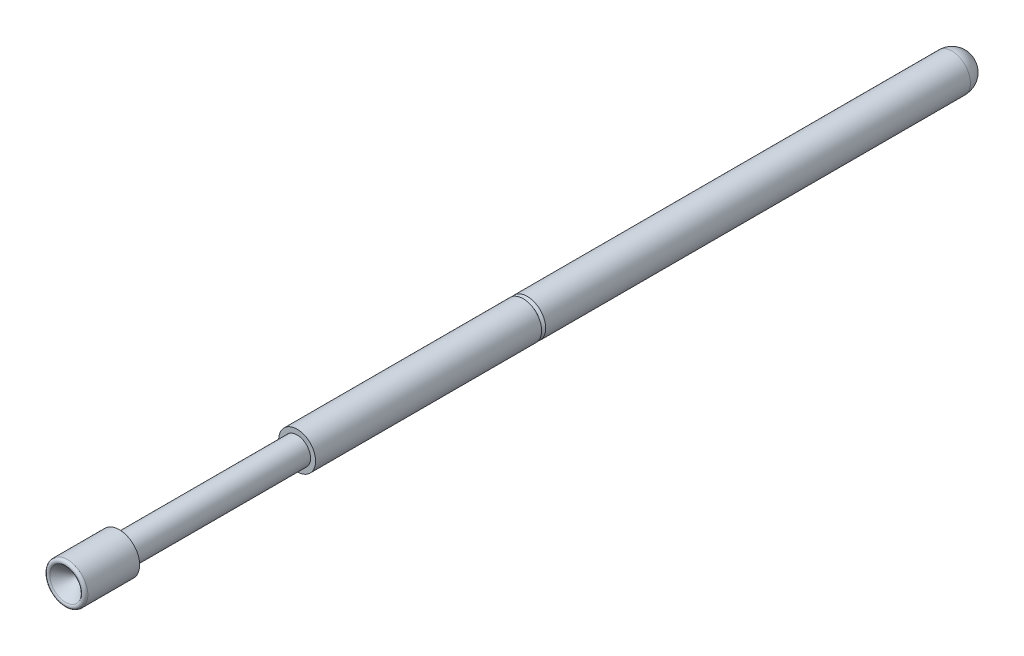
ISO-10303-21;
HEADER;
FILE_DESCRIPTION(('STEP AP214'),'2;1');
FILE_NAME('part.step','',(''),(''),'','','');
FILE_SCHEMA(('AUTOMOTIVE_DESIGN { 1 0 10303 214 1 1 1 1 }'));
ENDSEC;
DATA;
#1=APPLICATION_CONTEXT('core data for automotive mechanical design processes');
#2=APPLICATION_PROTOCOL_DEFINITION('international standard','automotive_design',2000,#1);
#3=PRODUCT_CONTEXT('',#1,'mechanical');
#4=PRODUCT('Part','Part','',(#3));
#5=PRODUCT_RELATED_PRODUCT_CATEGORY('part','',(#4));
#6=PRODUCT_DEFINITION_FORMATION('','',#4);
#7=PRODUCT_DEFINITION_CONTEXT('part definition',#1,'design');
#8=PRODUCT_DEFINITION('design','',#6,#7);
#9=PRODUCT_DEFINITION_SHAPE('','',#8);
#10=(LENGTH_UNIT() NAMED_UNIT(*) SI_UNIT(.MILLI.,.METRE.));
#11=(NAMED_UNIT(*) PLANE_ANGLE_UNIT() SI_UNIT($,.RADIAN.));
#12=(NAMED_UNIT(*) SI_UNIT($,.STERADIAN.) SOLID_ANGLE_UNIT());
#13=UNCERTAINTY_MEASURE_WITH_UNIT(LENGTH_MEASURE(1.E-05),#10,'distance_accuracy_value','');
#14=(GEOMETRIC_REPRESENTATION_CONTEXT(3) GLOBAL_UNCERTAINTY_ASSIGNED_CONTEXT((#13)) GLOBAL_UNIT_ASSIGNED_CONTEXT((#10,
#11,#12)) REPRESENTATION_CONTEXT('',''));
#15=CARTESIAN_POINT('',(0.,0.,0.));
#16=DIRECTION('',(0.,0.,1.));
#17=DIRECTION('',(1.,0.,0.));
#18=AXIS2_PLACEMENT_3D('',#15,#16,#17);
#19=CARTESIAN_POINT('',(0.,0.,0.680000000000002));
#20=DIRECTION('',(0.,0.,-1.));
#21=DIRECTION('',(-1.,0.,0.));
#22=AXIS2_PLACEMENT_3D('',#19,#20,#21);
#23=SPHERICAL_SURFACE('',#22,0.680000000000002);
#24=CARTESIAN_POINT('',(0.,0.,0.680000000000002));
#25=DIRECTION('',(0.,0.,-1.));
#26=DIRECTION('',(-1.,0.,0.));
#27=AXIS2_PLACEMENT_3D('',#24,#25,#26);
#28=CIRCLE('',#27,0.680000000000002);
#29=CARTESIAN_POINT('',(-0.680000000000002,0.,0.680000000000002));
#30=VERTEX_POINT('',#29);
#31=EDGE_CURVE('E78',#30,#30,#28,.T.);
#32=ORIENTED_EDGE('',*,*,#31,.T.);
#33=EDGE_LOOP('',(#32));
#34=FACE_BOUND('',#33,.T.);
#35=ADVANCED_FACE('F34',(#34),#23,.T.);
#36=CARTESIAN_POINT('',(0.,0.,33.3283227248675));
#37=DIRECTION('',(0.,0.,1.));
#38=DIRECTION('',(1.,0.,0.));
#39=AXIS2_PLACEMENT_3D('',#36,#37,#38);
#40=CONICAL_SURFACE('',#39,0.579289321881346,0.785398163397446);
#41=CARTESIAN_POINT('',(0.,0.,32.7490334029862));
#42=VERTEX_POINT('',#41);
#43=VERTEX_LOOP('',#42);
#44=FACE_BOUND('',#43,.T.);
#45=CARTESIAN_POINT('',(0.,0.,33.3283227248675));
#46=DIRECTION('',(0.,0.,-1.));
#47=DIRECTION('',(-1.,0.,0.));
#48=AXIS2_PLACEMENT_3D('',#45,#46,#47);
#49=CIRCLE('',#48,0.579289321881346);
#50=CARTESIAN_POINT('',(-0.579289321881346,0.,33.3283227248675));
#51=VERTEX_POINT('',#50);
#52=EDGE_CURVE('E11',#51,#51,#49,.T.);
#53=ORIENTED_EDGE('',*,*,#52,.F.);
#54=EDGE_LOOP('',(#53));
#55=FACE_BOUND('',#54,.T.);
#56=ADVANCED_FACE('F43',(#44,#55),#40,.F.);
#57=CARTESIAN_POINT('',(0.,0.,33.2576120467489));
#58=DIRECTION('',(0.,0.,-1.));
#59=DIRECTION('',(-1.,0.,0.));
#60=AXIS2_PLACEMENT_3D('',#57,#58,#59);
#61=TOROIDAL_SURFACE('',#60,0.649999999999996,0.100000000000001);
#62=ORIENTED_EDGE('',*,*,#52,.T.);
#63=EDGE_LOOP('',(#62));
#64=FACE_BOUND('',#63,.T.);
#65=CARTESIAN_POINT('',(0.,0.,33.2576120467489));
#66=DIRECTION('',(0.,0.,-1.));
#67=DIRECTION('',(-1.,0.,0.));
#68=AXIS2_PLACEMENT_3D('',#65,#66,#67);
#69=CIRCLE('',#68,0.749999999999997);
#70=CARTESIAN_POINT('',(-0.749999999999997,0.,33.2576120467489));
#71=VERTEX_POINT('',#70);
#72=EDGE_CURVE('E40',#71,#71,#69,.T.);
#73=ORIENTED_EDGE('',*,*,#72,.F.);
#74=EDGE_LOOP('',(#73));
#75=FACE_BOUND('',#74,.T.);
#76=ADVANCED_FACE('F46',(#64,#75),#61,.T.);
#77=CARTESIAN_POINT('',(0.,0.,0.));
#78=DIRECTION('',(0.,0.,-1.));
#79=DIRECTION('',(-1.,0.,0.));
#80=AXIS2_PLACEMENT_3D('',#77,#78,#79);
#81=CYLINDRICAL_SURFACE('',#80,0.749999999999996);
#82=ORIENTED_EDGE('',*,*,#72,.T.);
#83=EDGE_LOOP('',(#82));
#84=FACE_BOUND('',#83,.T.);
#85=CARTESIAN_POINT('',(0.,0.,31.35));
#86=DIRECTION('',(0.,0.,-1.));
#87=DIRECTION('',(-1.,0.,0.));
#88=AXIS2_PLACEMENT_3D('',#85,#86,#87);
#89=CIRCLE('',#88,0.749999999999996);
#90=CARTESIAN_POINT('',(-0.749999999999996,0.,31.35));
#91=VERTEX_POINT('',#90);
#92=EDGE_CURVE('E56',#91,#91,#89,.T.);
#93=ORIENTED_EDGE('',*,*,#92,.F.);
#94=EDGE_LOOP('',(#93));
#95=FACE_BOUND('',#94,.T.);
#96=ADVANCED_FACE('F51',(#84,#95),#81,.T.);
#97=CARTESIAN_POINT('',(-0.749999999999996,0.,31.35));
#98=DIRECTION('',(0.,0.,-1.));
#99=DIRECTION('',(-1.,0.,0.));
#100=AXIS2_PLACEMENT_3D('',#97,#98,#99);
#101=PLANE('',#100);
#102=ORIENTED_EDGE('',*,*,#92,.T.);
#103=EDGE_LOOP('',(#102));
#104=FACE_BOUND('',#103,.T.);
#105=CARTESIAN_POINT('',(0.,0.,31.35));
#106=DIRECTION('',(0.,0.,-1.));
#107=DIRECTION('',(-1.,0.,0.));
#108=AXIS2_PLACEMENT_3D('',#105,#106,#107);
#109=CIRCLE('',#108,0.494999999999996);
#110=CARTESIAN_POINT('',(-0.494999999999996,0.,31.35));
#111=VERTEX_POINT('',#110);
#112=EDGE_CURVE('E58',#111,#111,#109,.T.);
#113=ORIENTED_EDGE('',*,*,#112,.F.);
#114=EDGE_LOOP('',(#113));
#115=FACE_BOUND('',#114,.T.);
#116=ADVANCED_FACE('F111',(#104,#115),#101,.T.);
#117=CARTESIAN_POINT('',(0.,0.,0.));
#118=DIRECTION('',(0.,0.,-1.));
#119=DIRECTION('',(-1.,0.,0.));
#120=AXIS2_PLACEMENT_3D('',#117,#118,#119);
#121=CYLINDRICAL_SURFACE('',#120,0.494999999999996);
#122=ORIENTED_EDGE('',*,*,#112,.T.);
#123=EDGE_LOOP('',(#122));
#124=FACE_BOUND('',#123,.T.);
#125=CARTESIAN_POINT('',(0.,0.,24.8));
#126=DIRECTION('',(0.,0.,-1.));
#127=DIRECTION('',(-1.,0.,0.));
#128=AXIS2_PLACEMENT_3D('',#125,#126,#127);
#129=CIRCLE('',#128,0.494999999999996);
#130=CARTESIAN_POINT('',(-0.494999999999996,0.,24.8));
#131=VERTEX_POINT('',#130);
#132=EDGE_CURVE('E63',#131,#131,#129,.T.);
#133=ORIENTED_EDGE('',*,*,#132,.F.);
#134=EDGE_LOOP('',(#133));
#135=FACE_BOUND('',#134,.T.);
#136=ADVANCED_FACE('F118',(#124,#135),#121,.T.);
#137=CARTESIAN_POINT('',(-0.494999999999996,0.,24.8));
#138=DIRECTION('',(0.,0.,1.));
#139=DIRECTION('',(1.,0.,0.));
#140=AXIS2_PLACEMENT_3D('',#137,#138,#139);
#141=PLANE('',#140);
#142=ORIENTED_EDGE('',*,*,#132,.T.);
#143=EDGE_LOOP('',(#142));
#144=FACE_BOUND('',#143,.T.);
#145=CARTESIAN_POINT('',(0.,0.,24.8));
#146=DIRECTION('',(0.,0.,-1.));
#147=DIRECTION('',(-1.,0.,0.));
#148=AXIS2_PLACEMENT_3D('',#145,#146,#147);
#149=CIRCLE('',#148,0.679999999999997);
#150=CARTESIAN_POINT('',(-0.679999999999997,0.,24.8));
#151=VERTEX_POINT('',#150);
#152=EDGE_CURVE('E66',#151,#151,#149,.T.);
#153=ORIENTED_EDGE('',*,*,#152,.F.);
#154=EDGE_LOOP('',(#153));
#155=FACE_BOUND('',#154,.T.);
#156=ADVANCED_FACE('F126',(#144,#155),#141,.T.);
#157=CARTESIAN_POINT('',(0.,0.,0.));
#158=DIRECTION('',(0.,0.,-1.));
#159=DIRECTION('',(-1.,0.,0.));
#160=AXIS2_PLACEMENT_3D('',#157,#158,#159);
#161=CYLINDRICAL_SURFACE('',#160,0.679999999999998);
#162=ORIENTED_EDGE('',*,*,#152,.T.);
#163=EDGE_LOOP('',(#162));
#164=FACE_BOUND('',#163,.T.);
#165=CARTESIAN_POINT('',(0.,0.,16.475));
#166=DIRECTION('',(0.,0.,-1.));
#167=DIRECTION('',(-1.,0.,0.));
#168=AXIS2_PLACEMENT_3D('',#165,#166,#167);
#169=CIRCLE('',#168,0.68);
#170=CARTESIAN_POINT('',(-0.68,0.,16.475));
#171=VERTEX_POINT('',#170);
#172=EDGE_CURVE('E69',#171,#171,#169,.T.);
#173=ORIENTED_EDGE('',*,*,#172,.F.);
#174=EDGE_LOOP('',(#173));
#175=FACE_BOUND('',#174,.T.);
#176=ADVANCED_FACE('F134',(#164,#175),#161,.T.);
#177=CARTESIAN_POINT('',(0.,0.,16.4));
#178=DIRECTION('',(0.,0.,1.));
#179=DIRECTION('',(1.,0.,0.));
#180=AXIS2_PLACEMENT_3D('',#177,#178,#179);
#181=CONICAL_SURFACE('',#180,0.579289321881343,0.930691014621459);
#182=ORIENTED_EDGE('',*,*,#172,.T.);
#183=EDGE_LOOP('',(#182));
#184=FACE_BOUND('',#183,.T.);
#185=CARTESIAN_POINT('',(0.,0.,16.4));
#186=DIRECTION('',(0.,0.,-1.));
#187=DIRECTION('',(-1.,0.,0.));
#188=AXIS2_PLACEMENT_3D('',#185,#186,#187);
#189=CIRCLE('',#188,0.579289321881343);
#190=CARTESIAN_POINT('',(-0.579289321881343,0.,16.4));
#191=VERTEX_POINT('',#190);
#192=EDGE_CURVE('E72',#191,#191,#189,.T.);
#193=ORIENTED_EDGE('',*,*,#192,.F.);
#194=EDGE_LOOP('',(#193));
#195=FACE_BOUND('',#194,.T.);
#196=ADVANCED_FACE('F91',(#184,#195),#181,.T.);
#197=CARTESIAN_POINT('',(0.,0.,16.325));
#198=DIRECTION('',(0.,0.,-1.));
#199=DIRECTION('',(-1.,0.,0.));
#200=AXIS2_PLACEMENT_3D('',#197,#198,#199);
#201=CONICAL_SURFACE('',#200,0.68,0.930691014621481);
#202=ORIENTED_EDGE('',*,*,#192,.T.);
#203=EDGE_LOOP('',(#202));
#204=FACE_BOUND('',#203,.T.);
#205=CARTESIAN_POINT('',(0.,0.,16.325));
#206=DIRECTION('',(0.,0.,-1.));
#207=DIRECTION('',(-1.,0.,0.));
#208=AXIS2_PLACEMENT_3D('',#205,#206,#207);
#209=CIRCLE('',#208,0.68);
#210=CARTESIAN_POINT('',(-0.68,0.,16.325));
#211=VERTEX_POINT('',#210);
#212=EDGE_CURVE('E75',#211,#211,#209,.T.);
#213=ORIENTED_EDGE('',*,*,#212,.F.);
#214=EDGE_LOOP('',(#213));
#215=FACE_BOUND('',#214,.T.);
#216=ADVANCED_FACE('F85',(#204,#215),#201,.T.);
#217=CARTESIAN_POINT('',(0.,0.,0.));
#218=DIRECTION('',(0.,0.,-1.));
#219=DIRECTION('',(-1.,0.,0.));
#220=AXIS2_PLACEMENT_3D('',#217,#218,#219);
#221=CYLINDRICAL_SURFACE('',#220,0.680000000000001);
#222=ORIENTED_EDGE('',*,*,#212,.T.);
#223=EDGE_LOOP('',(#222));
#224=FACE_BOUND('',#223,.T.);
#225=ORIENTED_EDGE('',*,*,#31,.F.);
#226=EDGE_LOOP('',(#225));
#227=FACE_BOUND('',#226,.T.);
#228=ADVANCED_FACE('F83',(#224,#227),#221,.T.);
#229=CLOSED_SHELL('',(#35,#56,#76,#96,#116,#136,#156,#176,#196,#216,#228));
#230=MANIFOLD_SOLID_BREP('B2',#229);
#231=ADVANCED_BREP_SHAPE_REPRESENTATION('',(#18,#230),#14);
#232=SHAPE_DEFINITION_REPRESENTATION(#9,#231);
ENDSEC;
END-ISO-10303-21;
